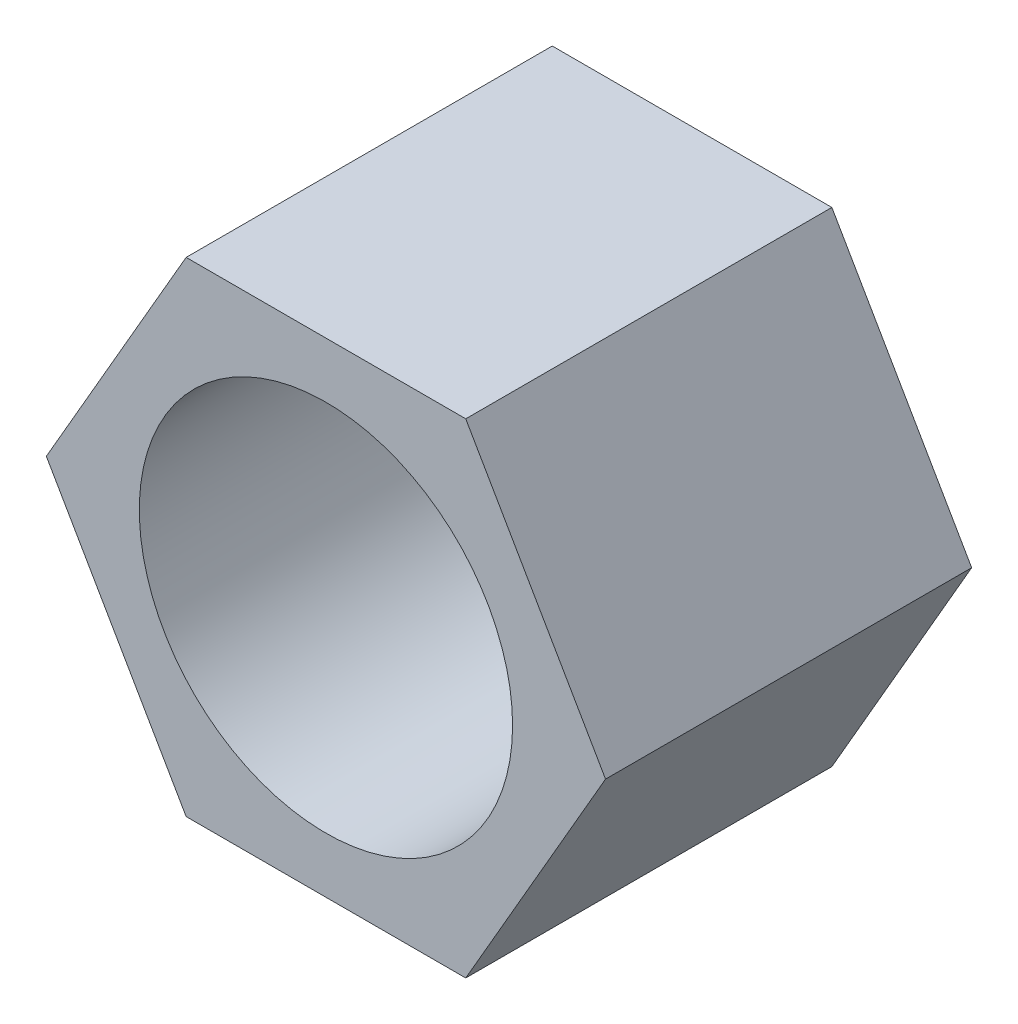
ISO-10303-21;
HEADER;
FILE_DESCRIPTION(('STEP AP214'),'2;1');
FILE_NAME('part.step','',(''),(''),'','','');
FILE_SCHEMA(('AUTOMOTIVE_DESIGN { 1 0 10303 214 1 1 1 1 }'));
ENDSEC;
DATA;
#1=APPLICATION_CONTEXT('core data for automotive mechanical design processes');
#2=APPLICATION_PROTOCOL_DEFINITION('international standard','automotive_design',2000,#1);
#3=PRODUCT_CONTEXT('',#1,'mechanical');
#4=PRODUCT('Part','Part','',(#3));
#5=PRODUCT_RELATED_PRODUCT_CATEGORY('part','',(#4));
#6=PRODUCT_DEFINITION_FORMATION('','',#4);
#7=PRODUCT_DEFINITION_CONTEXT('part definition',#1,'design');
#8=PRODUCT_DEFINITION('design','',#6,#7);
#9=PRODUCT_DEFINITION_SHAPE('','',#8);
#10=(LENGTH_UNIT() NAMED_UNIT(*) SI_UNIT(.MILLI.,.METRE.));
#11=(NAMED_UNIT(*) PLANE_ANGLE_UNIT() SI_UNIT($,.RADIAN.));
#12=(NAMED_UNIT(*) SI_UNIT($,.STERADIAN.) SOLID_ANGLE_UNIT());
#13=UNCERTAINTY_MEASURE_WITH_UNIT(LENGTH_MEASURE(1.E-05),#10,'distance_accuracy_value','');
#14=(GEOMETRIC_REPRESENTATION_CONTEXT(3) GLOBAL_UNCERTAINTY_ASSIGNED_CONTEXT((#13)) GLOBAL_UNIT_ASSIGNED_CONTEXT((#10,
#11,#12)) REPRESENTATION_CONTEXT('',''));
#15=CARTESIAN_POINT('',(0.,0.,0.));
#16=DIRECTION('',(0.,0.,1.));
#17=DIRECTION('',(1.,0.,0.));
#18=AXIS2_PLACEMENT_3D('',#15,#16,#17);
#19=CARTESIAN_POINT('',(5.49926131403129,-9.52499999999992,7.2009));
#20=DIRECTION('',(-0.866025403784442,0.499999999999995,0.));
#21=DIRECTION('',(-0.499999999999995,-0.866025403784442,0.));
#22=AXIS2_PLACEMENT_3D('',#19,#20,#21);
#23=PLANE('',#22);
#24=DIRECTION('',(0.499999999999995,0.866025403784441,0.));
#25=VECTOR('',#24,1.);
#26=CARTESIAN_POINT('',(5.49926131403129,-9.52499999999992,-7.2009));
#27=LINE('',#26,#25);
#28=CARTESIAN_POINT('',(5.49926131403129,-9.52499999999992,-7.2009));
#29=VERTEX_POINT('',#28);
#30=CARTESIAN_POINT('',(10.9985226280624,0.,-7.2009));
#31=VERTEX_POINT('',#30);
#32=EDGE_CURVE('E118',#29,#31,#27,.T.);
#33=ORIENTED_EDGE('',*,*,#32,.T.);
#34=DIRECTION('',(0.,0.,-1.));
#35=VECTOR('',#34,1.);
#36=CARTESIAN_POINT('',(10.9985226280624,0.,7.2009));
#37=LINE('',#36,#35);
#38=CARTESIAN_POINT('',(10.9985226280624,0.,7.2009));
#39=VERTEX_POINT('',#38);
#40=EDGE_CURVE('E11',#39,#31,#37,.T.);
#41=ORIENTED_EDGE('',*,*,#40,.F.);
#42=DIRECTION('',(0.499999999999995,0.866025403784441,0.));
#43=VECTOR('',#42,1.);
#44=CARTESIAN_POINT('',(5.49926131403129,-9.52499999999992,7.2009));
#45=LINE('',#44,#43);
#46=CARTESIAN_POINT('',(5.49926131403129,-9.52499999999992,7.2009));
#47=VERTEX_POINT('',#46);
#48=EDGE_CURVE('E129',#47,#39,#45,.T.);
#49=ORIENTED_EDGE('',*,*,#48,.F.);
#50=DIRECTION('',(0.,0.,-1.));
#51=VECTOR('',#50,1.);
#52=CARTESIAN_POINT('',(5.49926131403129,-9.52499999999992,7.2009));
#53=LINE('',#52,#51);
#54=EDGE_CURVE('E114',#47,#29,#53,.T.);
#55=ORIENTED_EDGE('',*,*,#54,.T.);
#56=EDGE_LOOP('',(#33,#41,#49,#55));
#57=FACE_BOUND('',#56,.T.);
#58=ADVANCED_FACE('F34',(#57),#23,.F.);
#59=CARTESIAN_POINT('',(10.9985226280624,0.,7.2009));
#60=DIRECTION('',(-0.866025403784438,-0.500000000000001,0.));
#61=DIRECTION('',(0.500000000000001,-0.866025403784438,0.));
#62=AXIS2_PLACEMENT_3D('',#59,#60,#61);
#63=PLANE('',#62);
#64=DIRECTION('',(-0.500000000000001,0.866025403784438,0.));
#65=VECTOR('',#64,1.);
#66=CARTESIAN_POINT('',(10.9985226280624,0.,-7.2009));
#67=LINE('',#66,#65);
#68=CARTESIAN_POINT('',(5.49926131403116,9.525,-7.2009));
#69=VERTEX_POINT('',#68);
#70=EDGE_CURVE('E121',#31,#69,#67,.T.);
#71=ORIENTED_EDGE('',*,*,#70,.T.);
#72=DIRECTION('',(0.,0.,-1.));
#73=VECTOR('',#72,1.);
#74=CARTESIAN_POINT('',(5.49926131403116,9.525,7.2009));
#75=LINE('',#74,#73);
#76=CARTESIAN_POINT('',(5.49926131403116,9.525,7.2009));
#77=VERTEX_POINT('',#76);
#78=EDGE_CURVE('E42',#77,#69,#75,.T.);
#79=ORIENTED_EDGE('',*,*,#78,.F.);
#80=DIRECTION('',(-0.500000000000001,0.866025403784438,0.));
#81=VECTOR('',#80,1.);
#82=CARTESIAN_POINT('',(10.9985226280624,0.,7.2009));
#83=LINE('',#82,#81);
#84=EDGE_CURVE('E87',#39,#77,#83,.T.);
#85=ORIENTED_EDGE('',*,*,#84,.F.);
#86=ORIENTED_EDGE('',*,*,#40,.T.);
#87=EDGE_LOOP('',(#71,#79,#85,#86));
#88=FACE_BOUND('',#87,.T.);
#89=ADVANCED_FACE('F154',(#88),#63,.F.);
#90=CARTESIAN_POINT('',(5.49926131403116,9.525,7.2009));
#91=DIRECTION('',(0.,-1.,0.));
#92=DIRECTION('',(1.,0.,0.));
#93=AXIS2_PLACEMENT_3D('',#90,#91,#92);
#94=PLANE('',#93);
#95=DIRECTION('',(-1.,0.,0.));
#96=VECTOR('',#95,1.);
#97=CARTESIAN_POINT('',(5.49926131403116,9.525,-7.2009));
#98=LINE('',#97,#96);
#99=CARTESIAN_POINT('',(-5.49926131403122,9.52499999999996,-7.2009));
#100=VERTEX_POINT('',#99);
#101=EDGE_CURVE('E124',#69,#100,#98,.T.);
#102=ORIENTED_EDGE('',*,*,#101,.T.);
#103=DIRECTION('',(0.,0.,-1.));
#104=VECTOR('',#103,1.);
#105=CARTESIAN_POINT('',(-5.49926131403122,9.52499999999996,7.2009));
#106=LINE('',#105,#104);
#107=CARTESIAN_POINT('',(-5.49926131403122,9.52499999999996,7.2009));
#108=VERTEX_POINT('',#107);
#109=EDGE_CURVE('E109',#108,#100,#106,.T.);
#110=ORIENTED_EDGE('',*,*,#109,.F.);
#111=DIRECTION('',(-1.,0.,0.));
#112=VECTOR('',#111,1.);
#113=CARTESIAN_POINT('',(5.49926131403116,9.525,7.2009));
#114=LINE('',#113,#112);
#115=EDGE_CURVE('E100',#77,#108,#114,.T.);
#116=ORIENTED_EDGE('',*,*,#115,.F.);
#117=ORIENTED_EDGE('',*,*,#78,.T.);
#118=EDGE_LOOP('',(#102,#110,#116,#117));
#119=FACE_BOUND('',#118,.T.);
#120=ADVANCED_FACE('F135',(#119),#94,.F.);
#121=CARTESIAN_POINT('',(-5.49926131403122,9.52499999999996,7.2009));
#122=DIRECTION('',(0.866025403784441,-0.499999999999995,0.));
#123=DIRECTION('',(0.499999999999995,0.866025403784442,0.));
#124=AXIS2_PLACEMENT_3D('',#121,#122,#123);
#125=PLANE('',#124);
#126=DIRECTION('',(-0.499999999999995,-0.866025403784442,0.));
#127=VECTOR('',#126,1.);
#128=CARTESIAN_POINT('',(-5.49926131403122,9.52499999999996,-7.2009));
#129=LINE('',#128,#127);
#130=CARTESIAN_POINT('',(-10.9985226280624,0.,-7.2009));
#131=VERTEX_POINT('',#130);
#132=EDGE_CURVE('E108',#100,#131,#129,.T.);
#133=ORIENTED_EDGE('',*,*,#132,.T.);
#134=DIRECTION('',(0.,0.,-1.));
#135=VECTOR('',#134,1.);
#136=CARTESIAN_POINT('',(-10.9985226280624,0.,7.2009));
#137=LINE('',#136,#135);
#138=CARTESIAN_POINT('',(-10.9985226280624,0.,7.2009));
#139=VERTEX_POINT('',#138);
#140=EDGE_CURVE('E105',#139,#131,#137,.T.);
#141=ORIENTED_EDGE('',*,*,#140,.F.);
#142=DIRECTION('',(-0.499999999999995,-0.866025403784442,0.));
#143=VECTOR('',#142,1.);
#144=CARTESIAN_POINT('',(-5.49926131403122,9.52499999999996,7.2009));
#145=LINE('',#144,#143);
#146=EDGE_CURVE('E94',#108,#139,#145,.T.);
#147=ORIENTED_EDGE('',*,*,#146,.F.);
#148=ORIENTED_EDGE('',*,*,#109,.T.);
#149=EDGE_LOOP('',(#133,#141,#147,#148));
#150=FACE_BOUND('',#149,.T.);
#151=ADVANCED_FACE('F106',(#150),#125,.F.);
#152=CARTESIAN_POINT('',(-10.9985226280624,0.,7.2009));
#153=DIRECTION('',(0.866025403784434,0.500000000000007,0.));
#154=DIRECTION('',(-0.500000000000007,0.866025403784435,0.));
#155=AXIS2_PLACEMENT_3D('',#152,#153,#154);
#156=PLANE('',#155);
#157=DIRECTION('',(0.500000000000007,-0.866025403784435,0.));
#158=VECTOR('',#157,1.);
#159=CARTESIAN_POINT('',(-10.9985226280624,0.,-7.2009));
#160=LINE('',#159,#158);
#161=CARTESIAN_POINT('',(-5.49926131403109,-9.52500000000004,-7.2009));
#162=VERTEX_POINT('',#161);
#163=EDGE_CURVE('E73',#131,#162,#160,.T.);
#164=ORIENTED_EDGE('',*,*,#163,.T.);
#165=DIRECTION('',(0.,0.,-1.));
#166=VECTOR('',#165,1.);
#167=CARTESIAN_POINT('',(-5.49926131403109,-9.52500000000004,7.2009));
#168=LINE('',#167,#166);
#169=CARTESIAN_POINT('',(-5.49926131403109,-9.52500000000004,7.2009));
#170=VERTEX_POINT('',#169);
#171=EDGE_CURVE('E110',#170,#162,#168,.T.);
#172=ORIENTED_EDGE('',*,*,#171,.F.);
#173=DIRECTION('',(0.500000000000007,-0.866025403784435,0.));
#174=VECTOR('',#173,1.);
#175=CARTESIAN_POINT('',(-10.9985226280624,0.,7.2009));
#176=LINE('',#175,#174);
#177=EDGE_CURVE('E98',#139,#170,#176,.T.);
#178=ORIENTED_EDGE('',*,*,#177,.F.);
#179=ORIENTED_EDGE('',*,*,#140,.T.);
#180=EDGE_LOOP('',(#164,#172,#178,#179));
#181=FACE_BOUND('',#180,.T.);
#182=ADVANCED_FACE('F112',(#181),#156,.F.);
#183=CARTESIAN_POINT('',(-5.49926131403109,-9.52500000000004,7.2009));
#184=DIRECTION('',(0.,1.,0.));
#185=DIRECTION('',(-1.,0.,0.));
#186=AXIS2_PLACEMENT_3D('',#183,#184,#185);
#187=PLANE('',#186);
#188=DIRECTION('',(1.,0.,0.));
#189=VECTOR('',#188,1.);
#190=CARTESIAN_POINT('',(-5.49926131403109,-9.52500000000004,-7.2009));
#191=LINE('',#190,#189);
#192=EDGE_CURVE('E79',#162,#29,#191,.T.);
#193=ORIENTED_EDGE('',*,*,#192,.T.);
#194=ORIENTED_EDGE('',*,*,#54,.F.);
#195=DIRECTION('',(1.,0.,0.));
#196=VECTOR('',#195,1.);
#197=CARTESIAN_POINT('',(-5.49926131403109,-9.52500000000004,7.2009));
#198=LINE('',#197,#196);
#199=EDGE_CURVE('E50',#170,#47,#198,.T.);
#200=ORIENTED_EDGE('',*,*,#199,.F.);
#201=ORIENTED_EDGE('',*,*,#171,.T.);
#202=EDGE_LOOP('',(#193,#194,#200,#201));
#203=FACE_BOUND('',#202,.T.);
#204=ADVANCED_FACE('F142',(#203),#187,.F.);
#205=CARTESIAN_POINT('',(0.,0.,7.2009));
#206=DIRECTION('',(0.,0.,1.));
#207=DIRECTION('',(1.,0.,0.));
#208=AXIS2_PLACEMENT_3D('',#205,#206,#207);
#209=PLANE('',#208);
#210=CARTESIAN_POINT('',(0.,0.,7.2009));
#211=DIRECTION('',(0.,0.,1.));
#212=DIRECTION('',(1.,0.,0.));
#213=AXIS2_PLACEMENT_3D('',#210,#211,#212);
#214=CIRCLE('',#213,7.34187);
#215=CARTESIAN_POINT('',(7.34187,0.,7.2009));
#216=VERTEX_POINT('',#215);
#217=EDGE_CURVE('E232',#216,#216,#214,.T.);
#218=ORIENTED_EDGE('',*,*,#217,.F.);
#219=EDGE_LOOP('',(#218));
#220=FACE_BOUND('',#219,.T.);
#221=ORIENTED_EDGE('',*,*,#48,.T.);
#222=ORIENTED_EDGE('',*,*,#84,.T.);
#223=ORIENTED_EDGE('',*,*,#115,.T.);
#224=ORIENTED_EDGE('',*,*,#146,.T.);
#225=ORIENTED_EDGE('',*,*,#177,.T.);
#226=ORIENTED_EDGE('',*,*,#199,.T.);
#227=EDGE_LOOP('',(#221,#222,#223,#224,#225,#226));
#228=FACE_BOUND('',#227,.T.);
#229=ADVANCED_FACE('F96',(#220,#228),#209,.T.);
#230=CARTESIAN_POINT('',(0.,0.,-7.2009));
#231=DIRECTION('',(0.,0.,1.));
#232=DIRECTION('',(1.,0.,0.));
#233=AXIS2_PLACEMENT_3D('',#230,#231,#232);
#234=PLANE('',#233);
#235=CARTESIAN_POINT('',(0.,0.,-7.2009));
#236=DIRECTION('',(0.,0.,-1.));
#237=DIRECTION('',(-1.,0.,0.));
#238=AXIS2_PLACEMENT_3D('',#235,#236,#237);
#239=CIRCLE('',#238,3.571875);
#240=CARTESIAN_POINT('',(-3.571875,0.,-7.2009));
#241=VERTEX_POINT('',#240);
#242=EDGE_CURVE('E122',#241,#241,#239,.T.);
#243=ORIENTED_EDGE('',*,*,#242,.F.);
#244=EDGE_LOOP('',(#243));
#245=FACE_BOUND('',#244,.T.);
#246=ORIENTED_EDGE('',*,*,#32,.F.);
#247=ORIENTED_EDGE('',*,*,#192,.F.);
#248=ORIENTED_EDGE('',*,*,#163,.F.);
#249=ORIENTED_EDGE('',*,*,#132,.F.);
#250=ORIENTED_EDGE('',*,*,#101,.F.);
#251=ORIENTED_EDGE('',*,*,#70,.F.);
#252=EDGE_LOOP('',(#246,#247,#248,#249,#250,#251));
#253=FACE_BOUND('',#252,.T.);
#254=ADVANCED_FACE('F138',(#245,#253),#234,.F.);
#255=CARTESIAN_POINT('',(0.,0.,-4.0259));
#256=DIRECTION('',(0.,0.,-1.));
#257=DIRECTION('',(-1.,0.,0.));
#258=AXIS2_PLACEMENT_3D('',#255,#256,#257);
#259=CYLINDRICAL_SURFACE('',#258,3.571875);
#260=CARTESIAN_POINT('',(0.,0.,-4.0259));
#261=DIRECTION('',(0.,0.,1.));
#262=DIRECTION('',(1.,0.,0.));
#263=AXIS2_PLACEMENT_3D('',#260,#261,#262);
#264=CIRCLE('',#263,3.571875);
#265=CARTESIAN_POINT('',(3.571875,0.,-4.0259));
#266=VERTEX_POINT('',#265);
#267=EDGE_CURVE('E234',#266,#266,#264,.F.);
#268=ORIENTED_EDGE('',*,*,#267,.F.);
#269=EDGE_LOOP('',(#268));
#270=FACE_BOUND('',#269,.T.);
#271=ORIENTED_EDGE('',*,*,#242,.T.);
#272=EDGE_LOOP('',(#271));
#273=FACE_BOUND('',#272,.T.);
#274=ADVANCED_FACE('F186',(#270,#273),#259,.F.);
#275=CARTESIAN_POINT('',(0.,0.,-4.0259));
#276=DIRECTION('',(0.,0.,1.));
#277=DIRECTION('',(1.,0.,0.));
#278=AXIS2_PLACEMENT_3D('',#275,#276,#277);
#279=PLANE('',#278);
#280=CARTESIAN_POINT('',(0.,0.,-4.0259));
#281=DIRECTION('',(0.,0.,1.));
#282=DIRECTION('',(1.,0.,0.));
#283=AXIS2_PLACEMENT_3D('',#280,#281,#282);
#284=CIRCLE('',#283,7.34187);
#285=CARTESIAN_POINT('',(7.34187,0.,-4.0259));
#286=VERTEX_POINT('',#285);
#287=EDGE_CURVE('E229',#286,#286,#284,.T.);
#288=ORIENTED_EDGE('',*,*,#287,.T.);
#289=EDGE_LOOP('',(#288));
#290=FACE_BOUND('',#289,.T.);
#291=ORIENTED_EDGE('',*,*,#267,.T.);
#292=EDGE_LOOP('',(#291));
#293=FACE_BOUND('',#292,.T.);
#294=ADVANCED_FACE('F195',(#290,#293),#279,.T.);
#295=CARTESIAN_POINT('',(0.,0.,-4.0259));
#296=DIRECTION('',(0.,0.,1.));
#297=DIRECTION('',(1.,0.,0.));
#298=AXIS2_PLACEMENT_3D('',#295,#296,#297);
#299=CYLINDRICAL_SURFACE('',#298,7.34187);
#300=ORIENTED_EDGE('',*,*,#287,.F.);
#301=EDGE_LOOP('',(#300));
#302=FACE_BOUND('',#301,.T.);
#303=ORIENTED_EDGE('',*,*,#217,.T.);
#304=EDGE_LOOP('',(#303));
#305=FACE_BOUND('',#304,.T.);
#306=ADVANCED_FACE('F210',(#302,#305),#299,.F.);
#307=CLOSED_SHELL('',(#58,#89,#120,#151,#182,#204,#229,#254,#274,#294,#306));
#308=MANIFOLD_SOLID_BREP('B2',#307);
#309=ADVANCED_BREP_SHAPE_REPRESENTATION('',(#18,#308),#14);
#310=SHAPE_DEFINITION_REPRESENTATION(#9,#309);
ENDSEC;
END-ISO-10303-21;
